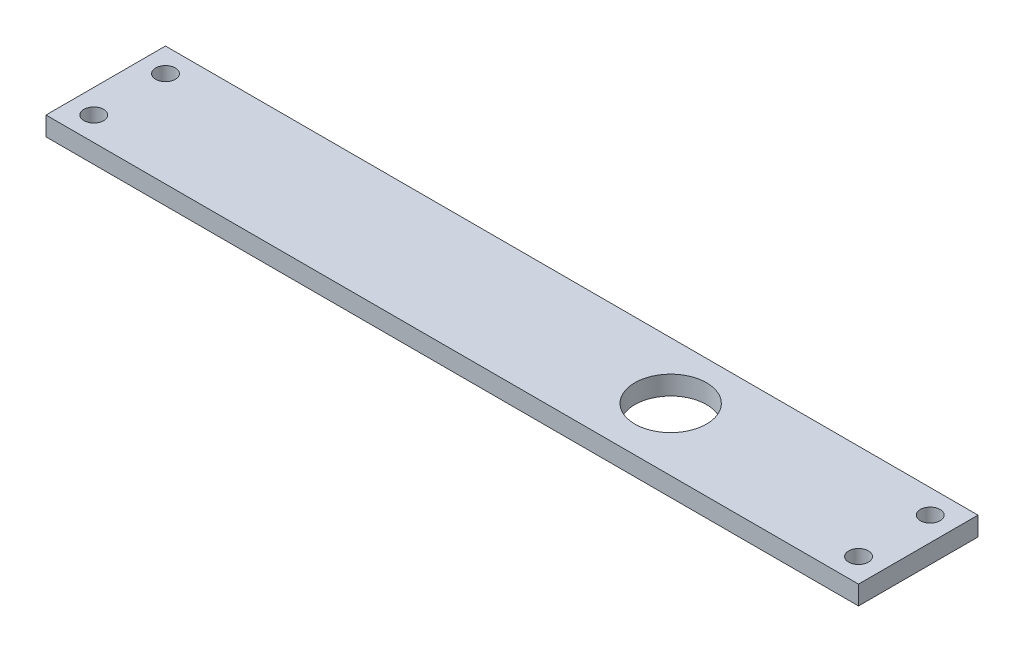
ISO-10303-21;
HEADER;
FILE_DESCRIPTION(('STEP AP214'),'2;1');
FILE_NAME('part.step','',(''),(''),'','','');
FILE_SCHEMA(('AUTOMOTIVE_DESIGN { 1 0 10303 214 1 1 1 1 }'));
ENDSEC;
DATA;
#1=APPLICATION_CONTEXT('core data for automotive mechanical design processes');
#2=APPLICATION_PROTOCOL_DEFINITION('international standard','automotive_design',2000,#1);
#3=PRODUCT_CONTEXT('',#1,'mechanical');
#4=PRODUCT('Part','Part','',(#3));
#5=PRODUCT_RELATED_PRODUCT_CATEGORY('part','',(#4));
#6=PRODUCT_DEFINITION_FORMATION('','',#4);
#7=PRODUCT_DEFINITION_CONTEXT('part definition',#1,'design');
#8=PRODUCT_DEFINITION('design','',#6,#7);
#9=PRODUCT_DEFINITION_SHAPE('','',#8);
#10=(LENGTH_UNIT() NAMED_UNIT(*) SI_UNIT(.MILLI.,.METRE.));
#11=(NAMED_UNIT(*) PLANE_ANGLE_UNIT() SI_UNIT($,.RADIAN.));
#12=(NAMED_UNIT(*) SI_UNIT($,.STERADIAN.) SOLID_ANGLE_UNIT());
#13=UNCERTAINTY_MEASURE_WITH_UNIT(LENGTH_MEASURE(1.E-05),#10,'distance_accuracy_value','');
#14=(GEOMETRIC_REPRESENTATION_CONTEXT(3) GLOBAL_UNCERTAINTY_ASSIGNED_CONTEXT((#13)) GLOBAL_UNIT_ASSIGNED_CONTEXT((#10,
#11,#12)) REPRESENTATION_CONTEXT('',''));
#15=CARTESIAN_POINT('',(0.,0.,0.));
#16=DIRECTION('',(0.,0.,1.));
#17=DIRECTION('',(1.,0.,0.));
#18=AXIS2_PLACEMENT_3D('',#15,#16,#17);
#19=CARTESIAN_POINT('',(0.,3.175,0.));
#20=DIRECTION('',(0.,1.,0.));
#21=DIRECTION('',(0.,0.,1.));
#22=AXIS2_PLACEMENT_3D('',#19,#20,#21);
#23=PLANE('',#22);
#24=CARTESIAN_POINT('',(4.,3.175,16.));
#25=DIRECTION('',(0.,1.,0.));
#26=DIRECTION('',(0.,0.,1.));
#27=AXIS2_PLACEMENT_3D('',#24,#25,#26);
#28=CIRCLE('',#27,1.65);
#29=CARTESIAN_POINT('',(4.,3.175,17.65));
#30=VERTEX_POINT('',#29);
#31=EDGE_CURVE('E127',#30,#30,#28,.T.);
#32=ORIENTED_EDGE('',*,*,#31,.F.);
#33=EDGE_LOOP('',(#32));
#34=FACE_BOUND('',#33,.T.);
#35=CARTESIAN_POINT('',(132.,3.175,4.));
#36=DIRECTION('',(0.,1.,0.));
#37=DIRECTION('',(0.,0.,1.));
#38=AXIS2_PLACEMENT_3D('',#35,#36,#37);
#39=CIRCLE('',#38,1.65000000000002);
#40=CARTESIAN_POINT('',(132.,3.175,5.65000000000002));
#41=VERTEX_POINT('',#40);
#42=EDGE_CURVE('E115',#41,#41,#39,.T.);
#43=ORIENTED_EDGE('',*,*,#42,.F.);
#44=EDGE_LOOP('',(#43));
#45=FACE_BOUND('',#44,.T.);
#46=DIRECTION('',(0.,0.,1.));
#47=VECTOR('',#46,1.);
#48=CARTESIAN_POINT('',(0.,3.175,0.));
#49=LINE('',#48,#47);
#50=CARTESIAN_POINT('',(0.,3.175,0.));
#51=VERTEX_POINT('',#50);
#52=CARTESIAN_POINT('',(0.,3.175,20.));
#53=VERTEX_POINT('',#52);
#54=EDGE_CURVE('E85',#51,#53,#49,.T.);
#55=ORIENTED_EDGE('',*,*,#54,.T.);
#56=DIRECTION('',(1.,0.,0.));
#57=VECTOR('',#56,1.);
#58=CARTESIAN_POINT('',(0.,3.175,20.));
#59=LINE('',#58,#57);
#60=CARTESIAN_POINT('',(136.,3.175,20.));
#61=VERTEX_POINT('',#60);
#62=EDGE_CURVE('E80',#53,#61,#59,.T.);
#63=ORIENTED_EDGE('',*,*,#62,.T.);
#64=DIRECTION('',(0.,0.,-1.));
#65=VECTOR('',#64,1.);
#66=CARTESIAN_POINT('',(136.,3.175,0.));
#67=LINE('',#66,#65);
#68=CARTESIAN_POINT('',(136.,3.175,0.));
#69=VERTEX_POINT('',#68);
#70=EDGE_CURVE('E83',#61,#69,#67,.T.);
#71=ORIENTED_EDGE('',*,*,#70,.T.);
#72=DIRECTION('',(-1.,0.,0.));
#73=VECTOR('',#72,1.);
#74=CARTESIAN_POINT('',(0.,3.175,0.));
#75=LINE('',#74,#73);
#76=EDGE_CURVE('E50',#69,#51,#75,.T.);
#77=ORIENTED_EDGE('',*,*,#76,.T.);
#78=EDGE_LOOP('',(#55,#63,#71,#77));
#79=FACE_BOUND('',#78,.T.);
#80=CARTESIAN_POINT('',(4.,3.175,4.));
#81=DIRECTION('',(0.,1.,0.));
#82=DIRECTION('',(0.,0.,1.));
#83=AXIS2_PLACEMENT_3D('',#80,#81,#82);
#84=CIRCLE('',#83,1.65);
#85=CARTESIAN_POINT('',(4.,3.175,5.65));
#86=VERTEX_POINT('',#85);
#87=EDGE_CURVE('E100',#86,#86,#84,.T.);
#88=ORIENTED_EDGE('',*,*,#87,.F.);
#89=EDGE_LOOP('',(#88));
#90=FACE_BOUND('',#89,.T.);
#91=CARTESIAN_POINT('',(94.08554011,3.175,9.52416591));
#92=DIRECTION('',(0.,1.,0.));
#93=DIRECTION('',(0.,0.,1.));
#94=AXIS2_PLACEMENT_3D('',#91,#92,#93);
#95=CIRCLE('',#94,6.00000000000002);
#96=CARTESIAN_POINT('',(94.08554011,3.175,15.52416591));
#97=VERTEX_POINT('',#96);
#98=EDGE_CURVE('E121',#97,#97,#95,.T.);
#99=ORIENTED_EDGE('',*,*,#98,.F.);
#100=EDGE_LOOP('',(#99));
#101=FACE_BOUND('',#100,.T.);
#102=CARTESIAN_POINT('',(132.,3.175,16.));
#103=DIRECTION('',(0.,1.,0.));
#104=DIRECTION('',(0.,0.,1.));
#105=AXIS2_PLACEMENT_3D('',#102,#103,#104);
#106=CIRCLE('',#105,1.65000000000002);
#107=CARTESIAN_POINT('',(132.,3.175,17.65));
#108=VERTEX_POINT('',#107);
#109=EDGE_CURVE('E133',#108,#108,#106,.T.);
#110=ORIENTED_EDGE('',*,*,#109,.F.);
#111=EDGE_LOOP('',(#110));
#112=FACE_BOUND('',#111,.T.);
#113=ADVANCED_FACE('F33',(#34,#45,#79,#90,#101,#112),#23,.T.);
#114=CARTESIAN_POINT('',(0.,0.,0.));
#115=DIRECTION('',(0.,1.,0.));
#116=DIRECTION('',(0.,0.,1.));
#117=AXIS2_PLACEMENT_3D('',#114,#115,#116);
#118=PLANE('',#117);
#119=DIRECTION('',(0.,0.,1.));
#120=VECTOR('',#119,1.);
#121=CARTESIAN_POINT('',(0.,0.,0.));
#122=LINE('',#121,#120);
#123=CARTESIAN_POINT('',(0.,0.,0.));
#124=VERTEX_POINT('',#123);
#125=CARTESIAN_POINT('',(0.,0.,20.));
#126=VERTEX_POINT('',#125);
#127=EDGE_CURVE('E97',#124,#126,#122,.T.);
#128=ORIENTED_EDGE('',*,*,#127,.F.);
#129=DIRECTION('',(-1.,0.,0.));
#130=VECTOR('',#129,1.);
#131=CARTESIAN_POINT('',(0.,0.,0.));
#132=LINE('',#131,#130);
#133=CARTESIAN_POINT('',(136.,0.,0.));
#134=VERTEX_POINT('',#133);
#135=EDGE_CURVE('E73',#134,#124,#132,.T.);
#136=ORIENTED_EDGE('',*,*,#135,.F.);
#137=DIRECTION('',(0.,0.,-1.));
#138=VECTOR('',#137,1.);
#139=CARTESIAN_POINT('',(136.,0.,0.));
#140=LINE('',#139,#138);
#141=CARTESIAN_POINT('',(136.,0.,20.));
#142=VERTEX_POINT('',#141);
#143=EDGE_CURVE('E67',#142,#134,#140,.T.);
#144=ORIENTED_EDGE('',*,*,#143,.F.);
#145=DIRECTION('',(1.,0.,0.));
#146=VECTOR('',#145,1.);
#147=CARTESIAN_POINT('',(0.,0.,20.));
#148=LINE('',#147,#146);
#149=EDGE_CURVE('E89',#126,#142,#148,.T.);
#150=ORIENTED_EDGE('',*,*,#149,.F.);
#151=EDGE_LOOP('',(#128,#136,#144,#150));
#152=FACE_BOUND('',#151,.T.);
#153=CARTESIAN_POINT('',(4.,0.,4.));
#154=DIRECTION('',(0.,1.,0.));
#155=DIRECTION('',(0.,0.,1.));
#156=AXIS2_PLACEMENT_3D('',#153,#154,#155);
#157=CIRCLE('',#156,1.65);
#158=CARTESIAN_POINT('',(4.,0.,5.65));
#159=VERTEX_POINT('',#158);
#160=EDGE_CURVE('E112',#159,#159,#157,.T.);
#161=ORIENTED_EDGE('',*,*,#160,.T.);
#162=EDGE_LOOP('',(#161));
#163=FACE_BOUND('',#162,.T.);
#164=CARTESIAN_POINT('',(132.,0.,4.));
#165=DIRECTION('',(0.,1.,0.));
#166=DIRECTION('',(0.,0.,1.));
#167=AXIS2_PLACEMENT_3D('',#164,#165,#166);
#168=CIRCLE('',#167,1.65000000000002);
#169=CARTESIAN_POINT('',(132.,0.,5.65000000000002));
#170=VERTEX_POINT('',#169);
#171=EDGE_CURVE('E118',#170,#170,#168,.T.);
#172=ORIENTED_EDGE('',*,*,#171,.T.);
#173=EDGE_LOOP('',(#172));
#174=FACE_BOUND('',#173,.T.);
#175=CARTESIAN_POINT('',(94.08554011,0.,9.52416591));
#176=DIRECTION('',(0.,1.,0.));
#177=DIRECTION('',(0.,0.,1.));
#178=AXIS2_PLACEMENT_3D('',#175,#176,#177);
#179=CIRCLE('',#178,6.00000000000002);
#180=CARTESIAN_POINT('',(94.08554011,0.,15.52416591));
#181=VERTEX_POINT('',#180);
#182=EDGE_CURVE('E124',#181,#181,#179,.T.);
#183=ORIENTED_EDGE('',*,*,#182,.T.);
#184=EDGE_LOOP('',(#183));
#185=FACE_BOUND('',#184,.T.);
#186=CARTESIAN_POINT('',(4.,0.,16.));
#187=DIRECTION('',(0.,1.,0.));
#188=DIRECTION('',(0.,0.,1.));
#189=AXIS2_PLACEMENT_3D('',#186,#187,#188);
#190=CIRCLE('',#189,1.65);
#191=CARTESIAN_POINT('',(4.,0.,17.65));
#192=VERTEX_POINT('',#191);
#193=EDGE_CURVE('E130',#192,#192,#190,.T.);
#194=ORIENTED_EDGE('',*,*,#193,.T.);
#195=EDGE_LOOP('',(#194));
#196=FACE_BOUND('',#195,.T.);
#197=CARTESIAN_POINT('',(132.,0.,16.));
#198=DIRECTION('',(0.,1.,0.));
#199=DIRECTION('',(0.,0.,1.));
#200=AXIS2_PLACEMENT_3D('',#197,#198,#199);
#201=CIRCLE('',#200,1.65000000000002);
#202=CARTESIAN_POINT('',(132.,0.,17.65));
#203=VERTEX_POINT('',#202);
#204=EDGE_CURVE('E136',#203,#203,#201,.T.);
#205=ORIENTED_EDGE('',*,*,#204,.T.);
#206=EDGE_LOOP('',(#205));
#207=FACE_BOUND('',#206,.T.);
#208=ADVANCED_FACE('F108',(#152,#163,#174,#185,#196,#207),#118,.F.);
#209=CARTESIAN_POINT('',(0.,3.175,0.));
#210=DIRECTION('',(1.,0.,0.));
#211=DIRECTION('',(0.,0.,-1.));
#212=AXIS2_PLACEMENT_3D('',#209,#210,#211);
#213=PLANE('',#212);
#214=ORIENTED_EDGE('',*,*,#127,.T.);
#215=DIRECTION('',(0.,-1.,0.));
#216=VECTOR('',#215,1.);
#217=CARTESIAN_POINT('',(0.,3.175,20.));
#218=LINE('',#217,#216);
#219=EDGE_CURVE('E11',#53,#126,#218,.T.);
#220=ORIENTED_EDGE('',*,*,#219,.F.);
#221=ORIENTED_EDGE('',*,*,#54,.F.);
#222=DIRECTION('',(0.,-1.,0.));
#223=VECTOR('',#222,1.);
#224=CARTESIAN_POINT('',(0.,3.175,0.));
#225=LINE('',#224,#223);
#226=EDGE_CURVE('E93',#51,#124,#225,.T.);
#227=ORIENTED_EDGE('',*,*,#226,.T.);
#228=EDGE_LOOP('',(#214,#220,#221,#227));
#229=FACE_BOUND('',#228,.T.);
#230=ADVANCED_FACE('F35',(#229),#213,.F.);
#231=CARTESIAN_POINT('',(0.,3.175,20.));
#232=DIRECTION('',(0.,0.,-1.));
#233=DIRECTION('',(-1.,0.,0.));
#234=AXIS2_PLACEMENT_3D('',#231,#232,#233);
#235=PLANE('',#234);
#236=ORIENTED_EDGE('',*,*,#149,.T.);
#237=DIRECTION('',(0.,-1.,0.));
#238=VECTOR('',#237,1.);
#239=CARTESIAN_POINT('',(136.,3.175,20.));
#240=LINE('',#239,#238);
#241=EDGE_CURVE('E42',#61,#142,#240,.T.);
#242=ORIENTED_EDGE('',*,*,#241,.F.);
#243=ORIENTED_EDGE('',*,*,#62,.F.);
#244=ORIENTED_EDGE('',*,*,#219,.T.);
#245=EDGE_LOOP('',(#236,#242,#243,#244));
#246=FACE_BOUND('',#245,.T.);
#247=ADVANCED_FACE('F88',(#246),#235,.F.);
#248=CARTESIAN_POINT('',(136.,3.175,0.));
#249=DIRECTION('',(-1.,0.,0.));
#250=DIRECTION('',(0.,0.,1.));
#251=AXIS2_PLACEMENT_3D('',#248,#249,#250);
#252=PLANE('',#251);
#253=ORIENTED_EDGE('',*,*,#143,.T.);
#254=DIRECTION('',(0.,-1.,0.));
#255=VECTOR('',#254,1.);
#256=CARTESIAN_POINT('',(136.,3.175,0.));
#257=LINE('',#256,#255);
#258=EDGE_CURVE('E90',#69,#134,#257,.T.);
#259=ORIENTED_EDGE('',*,*,#258,.F.);
#260=ORIENTED_EDGE('',*,*,#70,.F.);
#261=ORIENTED_EDGE('',*,*,#241,.T.);
#262=EDGE_LOOP('',(#253,#259,#260,#261));
#263=FACE_BOUND('',#262,.T.);
#264=ADVANCED_FACE('F91',(#263),#252,.F.);
#265=CARTESIAN_POINT('',(0.,3.175,0.));
#266=DIRECTION('',(0.,0.,1.));
#267=DIRECTION('',(1.,0.,0.));
#268=AXIS2_PLACEMENT_3D('',#265,#266,#267);
#269=PLANE('',#268);
#270=ORIENTED_EDGE('',*,*,#135,.T.);
#271=ORIENTED_EDGE('',*,*,#226,.F.);
#272=ORIENTED_EDGE('',*,*,#76,.F.);
#273=ORIENTED_EDGE('',*,*,#258,.T.);
#274=EDGE_LOOP('',(#270,#271,#272,#273));
#275=FACE_BOUND('',#274,.T.);
#276=ADVANCED_FACE('F105',(#275),#269,.F.);
#277=CARTESIAN_POINT('',(4.,3.175,4.));
#278=DIRECTION('',(0.,-1.,0.));
#279=DIRECTION('',(0.,0.,-1.));
#280=AXIS2_PLACEMENT_3D('',#277,#278,#279);
#281=CYLINDRICAL_SURFACE('',#280,1.65);
#282=ORIENTED_EDGE('',*,*,#87,.T.);
#283=EDGE_LOOP('',(#282));
#284=FACE_BOUND('',#283,.T.);
#285=ORIENTED_EDGE('',*,*,#160,.F.);
#286=EDGE_LOOP('',(#285));
#287=FACE_BOUND('',#286,.T.);
#288=ADVANCED_FACE('F155',(#284,#287),#281,.F.);
#289=CARTESIAN_POINT('',(132.,3.175,4.));
#290=DIRECTION('',(0.,-1.,0.));
#291=DIRECTION('',(0.,0.,-1.));
#292=AXIS2_PLACEMENT_3D('',#289,#290,#291);
#293=CYLINDRICAL_SURFACE('',#292,1.65000000000002);
#294=ORIENTED_EDGE('',*,*,#42,.T.);
#295=EDGE_LOOP('',(#294));
#296=FACE_BOUND('',#295,.T.);
#297=ORIENTED_EDGE('',*,*,#171,.F.);
#298=EDGE_LOOP('',(#297));
#299=FACE_BOUND('',#298,.T.);
#300=ADVANCED_FACE('F201',(#296,#299),#293,.F.);
#301=CARTESIAN_POINT('',(94.08554011,3.175,9.52416591));
#302=DIRECTION('',(0.,-1.,0.));
#303=DIRECTION('',(0.,0.,-1.));
#304=AXIS2_PLACEMENT_3D('',#301,#302,#303);
#305=CYLINDRICAL_SURFACE('',#304,6.00000000000002);
#306=ORIENTED_EDGE('',*,*,#98,.T.);
#307=EDGE_LOOP('',(#306));
#308=FACE_BOUND('',#307,.T.);
#309=ORIENTED_EDGE('',*,*,#182,.F.);
#310=EDGE_LOOP('',(#309));
#311=FACE_BOUND('',#310,.T.);
#312=ADVANCED_FACE('F209',(#308,#311),#305,.F.);
#313=CARTESIAN_POINT('',(4.,3.175,16.));
#314=DIRECTION('',(0.,-1.,0.));
#315=DIRECTION('',(0.,0.,-1.));
#316=AXIS2_PLACEMENT_3D('',#313,#314,#315);
#317=CYLINDRICAL_SURFACE('',#316,1.65);
#318=ORIENTED_EDGE('',*,*,#31,.T.);
#319=EDGE_LOOP('',(#318));
#320=FACE_BOUND('',#319,.T.);
#321=ORIENTED_EDGE('',*,*,#193,.F.);
#322=EDGE_LOOP('',(#321));
#323=FACE_BOUND('',#322,.T.);
#324=ADVANCED_FACE('F217',(#320,#323),#317,.F.);
#325=CARTESIAN_POINT('',(132.,3.175,16.));
#326=DIRECTION('',(0.,-1.,0.));
#327=DIRECTION('',(0.,0.,-1.));
#328=AXIS2_PLACEMENT_3D('',#325,#326,#327);
#329=CYLINDRICAL_SURFACE('',#328,1.65000000000002);
#330=ORIENTED_EDGE('',*,*,#109,.T.);
#331=EDGE_LOOP('',(#330));
#332=FACE_BOUND('',#331,.T.);
#333=ORIENTED_EDGE('',*,*,#204,.F.);
#334=EDGE_LOOP('',(#333));
#335=FACE_BOUND('',#334,.T.);
#336=ADVANCED_FACE('F142',(#332,#335),#329,.F.);
#337=CLOSED_SHELL('',(#113,#208,#230,#247,#264,#276,#288,#300,#312,#324,#336));
#338=MANIFOLD_SOLID_BREP('B2',#337);
#339=ADVANCED_BREP_SHAPE_REPRESENTATION('',(#18,#338),#14);
#340=SHAPE_DEFINITION_REPRESENTATION(#9,#339);
ENDSEC;
END-ISO-10303-21;
